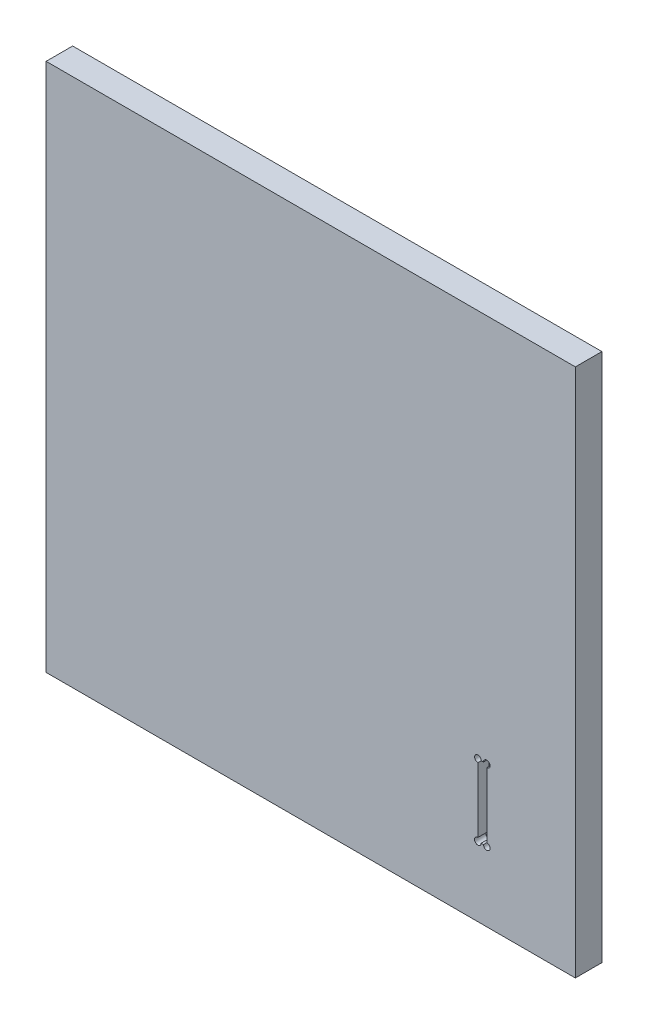
ISO-10303-21;
HEADER;
FILE_DESCRIPTION(('STEP AP214'),'2;1');
FILE_NAME('part.step','',(''),(''),'','','');
FILE_SCHEMA(('AUTOMOTIVE_DESIGN { 1 0 10303 214 1 1 1 1 }'));
ENDSEC;
DATA;
#1=APPLICATION_CONTEXT('core data for automotive mechanical design processes');
#2=APPLICATION_PROTOCOL_DEFINITION('international standard','automotive_design',2000,#1);
#3=PRODUCT_CONTEXT('',#1,'mechanical');
#4=PRODUCT('Part','Part','',(#3));
#5=PRODUCT_RELATED_PRODUCT_CATEGORY('part','',(#4));
#6=PRODUCT_DEFINITION_FORMATION('','',#4);
#7=PRODUCT_DEFINITION_CONTEXT('part definition',#1,'design');
#8=PRODUCT_DEFINITION('design','',#6,#7);
#9=PRODUCT_DEFINITION_SHAPE('','',#8);
#10=(LENGTH_UNIT() NAMED_UNIT(*) SI_UNIT(.MILLI.,.METRE.));
#11=(NAMED_UNIT(*) PLANE_ANGLE_UNIT() SI_UNIT($,.RADIAN.));
#12=(NAMED_UNIT(*) SI_UNIT($,.STERADIAN.) SOLID_ANGLE_UNIT());
#13=UNCERTAINTY_MEASURE_WITH_UNIT(LENGTH_MEASURE(1.E-05),#10,'distance_accuracy_value','');
#14=(GEOMETRIC_REPRESENTATION_CONTEXT(3) GLOBAL_UNCERTAINTY_ASSIGNED_CONTEXT((#13)) GLOBAL_UNIT_ASSIGNED_CONTEXT((#10,
#11,#12)) REPRESENTATION_CONTEXT('',''));
#15=CARTESIAN_POINT('',(0.,0.,0.));
#16=DIRECTION('',(0.,0.,1.));
#17=DIRECTION('',(1.,0.,0.));
#18=AXIS2_PLACEMENT_3D('',#15,#16,#17);
#19=CARTESIAN_POINT('',(190.,190.,19.05));
#20=DIRECTION('',(-1.,0.,0.));
#21=DIRECTION('',(0.,-1.,0.));
#22=AXIS2_PLACEMENT_3D('',#19,#20,#21);
#23=PLANE('',#22);
#24=DIRECTION('',(0.,1.,0.));
#25=VECTOR('',#24,1.);
#26=CARTESIAN_POINT('',(190.,190.,0.));
#27=LINE('',#26,#25);
#28=CARTESIAN_POINT('',(190.,-190.,0.));
#29=VERTEX_POINT('',#28);
#30=CARTESIAN_POINT('',(190.,190.,0.));
#31=VERTEX_POINT('',#30);
#32=EDGE_CURVE('E219',#29,#31,#27,.T.);
#33=ORIENTED_EDGE('',*,*,#32,.T.);
#34=DIRECTION('',(0.,0.,-1.));
#35=VECTOR('',#34,1.);
#36=CARTESIAN_POINT('',(190.,190.,19.05));
#37=LINE('',#36,#35);
#38=CARTESIAN_POINT('',(190.,190.,19.05));
#39=VERTEX_POINT('',#38);
#40=EDGE_CURVE('E12',#39,#31,#37,.T.);
#41=ORIENTED_EDGE('',*,*,#40,.F.);
#42=DIRECTION('',(0.,1.,0.));
#43=VECTOR('',#42,1.);
#44=CARTESIAN_POINT('',(190.,190.,19.05));
#45=LINE('',#44,#43);
#46=CARTESIAN_POINT('',(190.,-190.,19.05));
#47=VERTEX_POINT('',#46);
#48=EDGE_CURVE('E208',#47,#39,#45,.T.);
#49=ORIENTED_EDGE('',*,*,#48,.F.);
#50=DIRECTION('',(0.,0.,-1.));
#51=VECTOR('',#50,1.);
#52=CARTESIAN_POINT('',(190.,-190.,19.05));
#53=LINE('',#52,#51);
#54=EDGE_CURVE('E218',#47,#29,#53,.T.);
#55=ORIENTED_EDGE('',*,*,#54,.T.);
#56=EDGE_LOOP('',(#33,#41,#49,#55));
#57=FACE_BOUND('',#56,.T.);
#58=ADVANCED_FACE('F42',(#57),#23,.F.);
#59=CARTESIAN_POINT('',(-190.,190.,19.05));
#60=DIRECTION('',(0.,-1.,0.));
#61=DIRECTION('',(0.,0.,-1.));
#62=AXIS2_PLACEMENT_3D('',#59,#60,#61);
#63=PLANE('',#62);
#64=DIRECTION('',(-1.,0.,0.));
#65=VECTOR('',#64,1.);
#66=CARTESIAN_POINT('',(-190.,190.,0.));
#67=LINE('',#66,#65);
#68=CARTESIAN_POINT('',(-190.,190.,0.));
#69=VERTEX_POINT('',#68);
#70=EDGE_CURVE('E223',#31,#69,#67,.T.);
#71=ORIENTED_EDGE('',*,*,#70,.T.);
#72=DIRECTION('',(0.,0.,-1.));
#73=VECTOR('',#72,1.);
#74=CARTESIAN_POINT('',(-190.,190.,19.05));
#75=LINE('',#74,#73);
#76=CARTESIAN_POINT('',(-190.,190.,19.05));
#77=VERTEX_POINT('',#76);
#78=EDGE_CURVE('E50',#77,#69,#75,.T.);
#79=ORIENTED_EDGE('',*,*,#78,.F.);
#80=DIRECTION('',(-1.,0.,0.));
#81=VECTOR('',#80,1.);
#82=CARTESIAN_POINT('',(-190.,190.,19.05));
#83=LINE('',#82,#81);
#84=EDGE_CURVE('E94',#39,#77,#83,.T.);
#85=ORIENTED_EDGE('',*,*,#84,.F.);
#86=ORIENTED_EDGE('',*,*,#40,.T.);
#87=EDGE_LOOP('',(#71,#79,#85,#86));
#88=FACE_BOUND('',#87,.T.);
#89=ADVANCED_FACE('F259',(#88),#63,.F.);
#90=CARTESIAN_POINT('',(-190.,190.,19.05));
#91=DIRECTION('',(1.,0.,0.));
#92=DIRECTION('',(0.,1.,0.));
#93=AXIS2_PLACEMENT_3D('',#90,#91,#92);
#94=PLANE('',#93);
#95=DIRECTION('',(0.,-1.,0.));
#96=VECTOR('',#95,1.);
#97=CARTESIAN_POINT('',(-190.,190.,0.));
#98=LINE('',#97,#96);
#99=CARTESIAN_POINT('',(-190.,-190.,0.));
#100=VERTEX_POINT('',#99);
#101=EDGE_CURVE('E227',#69,#100,#98,.T.);
#102=ORIENTED_EDGE('',*,*,#101,.T.);
#103=DIRECTION('',(0.,0.,-1.));
#104=VECTOR('',#103,1.);
#105=CARTESIAN_POINT('',(-190.,-190.,19.05));
#106=LINE('',#105,#104);
#107=CARTESIAN_POINT('',(-190.,-190.,19.05));
#108=VERTEX_POINT('',#107);
#109=EDGE_CURVE('E234',#108,#100,#106,.T.);
#110=ORIENTED_EDGE('',*,*,#109,.F.);
#111=DIRECTION('',(0.,-1.,0.));
#112=VECTOR('',#111,1.);
#113=CARTESIAN_POINT('',(-190.,190.,19.05));
#114=LINE('',#113,#112);
#115=EDGE_CURVE('E213',#77,#108,#114,.T.);
#116=ORIENTED_EDGE('',*,*,#115,.F.);
#117=ORIENTED_EDGE('',*,*,#78,.T.);
#118=EDGE_LOOP('',(#102,#110,#116,#117));
#119=FACE_BOUND('',#118,.T.);
#120=ADVANCED_FACE('F241',(#119),#94,.F.);
#121=CARTESIAN_POINT('',(-190.,-190.,19.05));
#122=DIRECTION('',(0.,1.,0.));
#123=DIRECTION('',(0.,0.,1.));
#124=AXIS2_PLACEMENT_3D('',#121,#122,#123);
#125=PLANE('',#124);
#126=DIRECTION('',(1.,0.,0.));
#127=VECTOR('',#126,1.);
#128=CARTESIAN_POINT('',(-190.,-190.,0.));
#129=LINE('',#128,#127);
#130=EDGE_CURVE('E87',#100,#29,#129,.T.);
#131=ORIENTED_EDGE('',*,*,#130,.T.);
#132=ORIENTED_EDGE('',*,*,#54,.F.);
#133=DIRECTION('',(1.,0.,0.));
#134=VECTOR('',#133,1.);
#135=CARTESIAN_POINT('',(-190.,-190.,19.05));
#136=LINE('',#135,#134);
#137=EDGE_CURVE('E66',#108,#47,#136,.T.);
#138=ORIENTED_EDGE('',*,*,#137,.F.);
#139=ORIENTED_EDGE('',*,*,#109,.T.);
#140=EDGE_LOOP('',(#131,#132,#138,#139));
#141=FACE_BOUND('',#140,.T.);
#142=ADVANCED_FACE('F249',(#141),#125,.F.);
#143=CARTESIAN_POINT('',(0.,0.,19.05));
#144=DIRECTION('',(0.,0.,1.));
#145=DIRECTION('',(1.,0.,0.));
#146=AXIS2_PLACEMENT_3D('',#143,#144,#145);
#147=PLANE('',#146);
#148=CARTESIAN_POINT('',(120.,-140.,19.05));
#149=DIRECTION('',(0.,0.,1.));
#150=DIRECTION('',(1.,0.,0.));
#151=AXIS2_PLACEMENT_3D('',#148,#149,#150);
#152=CIRCLE('',#151,2.38125);
#153=CARTESIAN_POINT('',(120.,-137.61875,19.05));
#154=VERTEX_POINT('',#153);
#155=CARTESIAN_POINT('',(122.38125,-140.,19.05));
#156=VERTEX_POINT('',#155);
#157=EDGE_CURVE('E57',#154,#156,#152,.T.);
#158=ORIENTED_EDGE('',*,*,#157,.F.);
#159=DIRECTION('',(0.,-1.,0.));
#160=VECTOR('',#159,1.);
#161=CARTESIAN_POINT('',(120.,-137.61875,19.05));
#162=LINE('',#161,#160);
#163=CARTESIAN_POINT('',(120.,-91.0811187627877,19.05));
#164=VERTEX_POINT('',#163);
#165=EDGE_CURVE('E164',#164,#154,#162,.T.);
#166=ORIENTED_EDGE('',*,*,#165,.F.);
#167=CARTESIAN_POINT('',(120.025,-88.7,19.05));
#168=DIRECTION('',(0.,0.,1.));
#169=DIRECTION('',(1.,0.,0.));
#170=AXIS2_PLACEMENT_3D('',#167,#168,#169);
#171=CIRCLE('',#170,2.38125);
#172=CARTESIAN_POINT('',(122.40625,-88.7,19.05));
#173=VERTEX_POINT('',#172);
#174=EDGE_CURVE('E168',#173,#164,#171,.T.);
#175=ORIENTED_EDGE('',*,*,#174,.F.);
#176=DIRECTION('',(-1.,0.,0.));
#177=VECTOR('',#176,1.);
#178=CARTESIAN_POINT('',(122.40625,-88.7,19.05));
#179=LINE('',#178,#177);
#180=CARTESIAN_POINT('',(124.01875,-88.7,19.05));
#181=VERTEX_POINT('',#180);
#182=EDGE_CURVE('E393',#181,#173,#179,.T.);
#183=ORIENTED_EDGE('',*,*,#182,.F.);
#184=CARTESIAN_POINT('',(126.4,-88.7,19.05));
#185=DIRECTION('',(0.,0.,1.));
#186=DIRECTION('',(1.,0.,0.));
#187=AXIS2_PLACEMENT_3D('',#184,#185,#186);
#188=CIRCLE('',#187,2.38124999999999);
#189=CARTESIAN_POINT('',(126.4,-91.08125,19.05));
#190=VERTEX_POINT('',#189);
#191=EDGE_CURVE('E389',#190,#181,#188,.T.);
#192=ORIENTED_EDGE('',*,*,#191,.F.);
#193=DIRECTION('',(0.,1.,0.));
#194=VECTOR('',#193,1.);
#195=CARTESIAN_POINT('',(126.4,-137.61875,19.05));
#196=LINE('',#195,#194);
#197=CARTESIAN_POINT('',(126.4,-137.61875,19.05));
#198=VERTEX_POINT('',#197);
#199=EDGE_CURVE('E384',#198,#190,#196,.T.);
#200=ORIENTED_EDGE('',*,*,#199,.F.);
#201=CARTESIAN_POINT('',(126.4,-140.,19.05));
#202=DIRECTION('',(0.,0.,1.));
#203=DIRECTION('',(1.,0.,0.));
#204=AXIS2_PLACEMENT_3D('',#201,#202,#203);
#205=CIRCLE('',#204,2.38124999999999);
#206=CARTESIAN_POINT('',(124.01875,-140.,19.05));
#207=VERTEX_POINT('',#206);
#208=EDGE_CURVE('E379',#207,#198,#205,.T.);
#209=ORIENTED_EDGE('',*,*,#208,.F.);
#210=DIRECTION('',(1.,0.,0.));
#211=VECTOR('',#210,1.);
#212=CARTESIAN_POINT('',(122.38125,-140.,19.05));
#213=LINE('',#212,#211);
#214=EDGE_CURVE('E193',#156,#207,#213,.T.);
#215=ORIENTED_EDGE('',*,*,#214,.F.);
#216=EDGE_LOOP('',(#158,#166,#175,#183,#192,#200,#209,#215));
#217=FACE_BOUND('',#216,.T.);
#218=ORIENTED_EDGE('',*,*,#48,.T.);
#219=ORIENTED_EDGE('',*,*,#84,.T.);
#220=ORIENTED_EDGE('',*,*,#115,.T.);
#221=ORIENTED_EDGE('',*,*,#137,.T.);
#222=EDGE_LOOP('',(#218,#219,#220,#221));
#223=FACE_BOUND('',#222,.T.);
#224=ADVANCED_FACE('F251',(#217,#223),#147,.T.);
#225=CARTESIAN_POINT('',(0.,0.,0.));
#226=DIRECTION('',(0.,0.,1.));
#227=DIRECTION('',(1.,0.,0.));
#228=AXIS2_PLACEMENT_3D('',#225,#226,#227);
#229=PLANE('',#228);
#230=ORIENTED_EDGE('',*,*,#32,.F.);
#231=ORIENTED_EDGE('',*,*,#130,.F.);
#232=ORIENTED_EDGE('',*,*,#101,.F.);
#233=ORIENTED_EDGE('',*,*,#70,.F.);
#234=EDGE_LOOP('',(#230,#231,#232,#233));
#235=FACE_BOUND('',#234,.T.);
#236=ADVANCED_FACE('F245',(#235),#229,.F.);
#237=CARTESIAN_POINT('',(120.,-140.,11.05));
#238=DIRECTION('',(0.,0.,1.));
#239=DIRECTION('',(1.,0.,0.));
#240=AXIS2_PLACEMENT_3D('',#237,#238,#239);
#241=CYLINDRICAL_SURFACE('',#240,2.38125);
#242=ORIENTED_EDGE('',*,*,#157,.T.);
#243=DIRECTION('',(0.,0.,1.));
#244=VECTOR('',#243,1.);
#245=CARTESIAN_POINT('',(122.38125,-140.,11.05));
#246=LINE('',#245,#244);
#247=CARTESIAN_POINT('',(122.38125,-140.,11.05));
#248=VERTEX_POINT('',#247);
#249=EDGE_CURVE('E138',#248,#156,#246,.T.);
#250=ORIENTED_EDGE('',*,*,#249,.F.);
#251=CARTESIAN_POINT('',(120.,-140.,11.05));
#252=DIRECTION('',(0.,0.,1.));
#253=DIRECTION('',(1.,0.,0.));
#254=AXIS2_PLACEMENT_3D('',#251,#252,#253);
#255=CIRCLE('',#254,2.38125);
#256=CARTESIAN_POINT('',(120.,-137.61875,11.05));
#257=VERTEX_POINT('',#256);
#258=EDGE_CURVE('E142',#257,#248,#255,.T.);
#259=ORIENTED_EDGE('',*,*,#258,.F.);
#260=DIRECTION('',(0.,0.,1.));
#261=VECTOR('',#260,1.);
#262=CARTESIAN_POINT('',(120.,-137.61875,11.05));
#263=LINE('',#262,#261);
#264=EDGE_CURVE('E224',#257,#154,#263,.T.);
#265=ORIENTED_EDGE('',*,*,#264,.T.);
#266=EDGE_LOOP('',(#242,#250,#259,#265));
#267=FACE_BOUND('',#266,.T.);
#268=ADVANCED_FACE('F140',(#267),#241,.F.);
#269=CARTESIAN_POINT('',(120.,-137.61875,11.05));
#270=DIRECTION('',(-1.,0.,0.));
#271=DIRECTION('',(0.,0.,1.));
#272=AXIS2_PLACEMENT_3D('',#269,#270,#271);
#273=PLANE('',#272);
#274=ORIENTED_EDGE('',*,*,#165,.T.);
#275=ORIENTED_EDGE('',*,*,#264,.F.);
#276=DIRECTION('',(0.,-1.,0.));
#277=VECTOR('',#276,1.);
#278=CARTESIAN_POINT('',(120.,-137.61875,11.05));
#279=LINE('',#278,#277);
#280=CARTESIAN_POINT('',(120.,-91.0811187627877,11.05));
#281=VERTEX_POINT('',#280);
#282=EDGE_CURVE('E149',#281,#257,#279,.T.);
#283=ORIENTED_EDGE('',*,*,#282,.F.);
#284=DIRECTION('',(0.,0.,1.));
#285=VECTOR('',#284,1.);
#286=CARTESIAN_POINT('',(120.,-91.0811187627877,11.05));
#287=LINE('',#286,#285);
#288=EDGE_CURVE('E425',#281,#164,#287,.T.);
#289=ORIENTED_EDGE('',*,*,#288,.T.);
#290=EDGE_LOOP('',(#274,#275,#283,#289));
#291=FACE_BOUND('',#290,.T.);
#292=ADVANCED_FACE('F298',(#291),#273,.F.);
#293=CARTESIAN_POINT('',(120.025,-88.7,11.05));
#294=DIRECTION('',(0.,0.,1.));
#295=DIRECTION('',(1.,0.,0.));
#296=AXIS2_PLACEMENT_3D('',#293,#294,#295);
#297=CYLINDRICAL_SURFACE('',#296,2.38125);
#298=ORIENTED_EDGE('',*,*,#174,.T.);
#299=ORIENTED_EDGE('',*,*,#288,.F.);
#300=CARTESIAN_POINT('',(120.025,-88.7,11.05));
#301=DIRECTION('',(0.,0.,1.));
#302=DIRECTION('',(1.,0.,0.));
#303=AXIS2_PLACEMENT_3D('',#300,#301,#302);
#304=CIRCLE('',#303,2.38125);
#305=CARTESIAN_POINT('',(122.40625,-88.7,11.05));
#306=VERTEX_POINT('',#305);
#307=EDGE_CURVE('E185',#306,#281,#304,.T.);
#308=ORIENTED_EDGE('',*,*,#307,.F.);
#309=DIRECTION('',(0.,0.,1.));
#310=VECTOR('',#309,1.);
#311=CARTESIAN_POINT('',(122.40625,-88.7,11.05));
#312=LINE('',#311,#310);
#313=EDGE_CURVE('E420',#306,#173,#312,.T.);
#314=ORIENTED_EDGE('',*,*,#313,.T.);
#315=EDGE_LOOP('',(#298,#299,#308,#314));
#316=FACE_BOUND('',#315,.T.);
#317=ADVANCED_FACE('F307',(#316),#297,.F.);
#318=CARTESIAN_POINT('',(122.40625,-88.7,11.05));
#319=DIRECTION('',(0.,1.,0.));
#320=DIRECTION('',(0.,0.,1.));
#321=AXIS2_PLACEMENT_3D('',#318,#319,#320);
#322=PLANE('',#321);
#323=ORIENTED_EDGE('',*,*,#182,.T.);
#324=ORIENTED_EDGE('',*,*,#313,.F.);
#325=DIRECTION('',(-1.,0.,0.));
#326=VECTOR('',#325,1.);
#327=CARTESIAN_POINT('',(122.40625,-88.7,11.05));
#328=LINE('',#327,#326);
#329=CARTESIAN_POINT('',(124.01875,-88.7,11.05));
#330=VERTEX_POINT('',#329);
#331=EDGE_CURVE('E181',#330,#306,#328,.T.);
#332=ORIENTED_EDGE('',*,*,#331,.F.);
#333=DIRECTION('',(0.,0.,1.));
#334=VECTOR('',#333,1.);
#335=CARTESIAN_POINT('',(124.01875,-88.7,11.05));
#336=LINE('',#335,#334);
#337=EDGE_CURVE('E410',#330,#181,#336,.T.);
#338=ORIENTED_EDGE('',*,*,#337,.T.);
#339=EDGE_LOOP('',(#323,#324,#332,#338));
#340=FACE_BOUND('',#339,.T.);
#341=ADVANCED_FACE('F317',(#340),#322,.F.);
#342=CARTESIAN_POINT('',(126.4,-88.7,11.05));
#343=DIRECTION('',(0.,0.,1.));
#344=DIRECTION('',(1.,0.,0.));
#345=AXIS2_PLACEMENT_3D('',#342,#343,#344);
#346=CYLINDRICAL_SURFACE('',#345,2.38124999999999);
#347=ORIENTED_EDGE('',*,*,#191,.T.);
#348=ORIENTED_EDGE('',*,*,#337,.F.);
#349=CARTESIAN_POINT('',(126.4,-88.7,11.05));
#350=DIRECTION('',(0.,0.,1.));
#351=DIRECTION('',(1.,0.,0.));
#352=AXIS2_PLACEMENT_3D('',#349,#350,#351);
#353=CIRCLE('',#352,2.38124999999999);
#354=CARTESIAN_POINT('',(126.4,-91.08125,11.05));
#355=VERTEX_POINT('',#354);
#356=EDGE_CURVE('E177',#355,#330,#353,.T.);
#357=ORIENTED_EDGE('',*,*,#356,.F.);
#358=DIRECTION('',(0.,0.,1.));
#359=VECTOR('',#358,1.);
#360=CARTESIAN_POINT('',(126.4,-91.08125,11.05));
#361=LINE('',#360,#359);
#362=EDGE_CURVE('E406',#355,#190,#361,.T.);
#363=ORIENTED_EDGE('',*,*,#362,.T.);
#364=EDGE_LOOP('',(#347,#348,#357,#363));
#365=FACE_BOUND('',#364,.T.);
#366=ADVANCED_FACE('F327',(#365),#346,.F.);
#367=CARTESIAN_POINT('',(126.4,-137.61875,11.05));
#368=DIRECTION('',(1.,0.,0.));
#369=DIRECTION('',(0.,0.,-1.));
#370=AXIS2_PLACEMENT_3D('',#367,#368,#369);
#371=PLANE('',#370);
#372=ORIENTED_EDGE('',*,*,#199,.T.);
#373=ORIENTED_EDGE('',*,*,#362,.F.);
#374=DIRECTION('',(0.,1.,0.));
#375=VECTOR('',#374,1.);
#376=CARTESIAN_POINT('',(126.4,-137.61875,11.05));
#377=LINE('',#376,#375);
#378=CARTESIAN_POINT('',(126.4,-137.61875,11.05));
#379=VERTEX_POINT('',#378);
#380=EDGE_CURVE('E173',#379,#355,#377,.T.);
#381=ORIENTED_EDGE('',*,*,#380,.F.);
#382=DIRECTION('',(0.,0.,1.));
#383=VECTOR('',#382,1.);
#384=CARTESIAN_POINT('',(126.4,-137.61875,11.05));
#385=LINE('',#384,#383);
#386=EDGE_CURVE('E381',#379,#198,#385,.T.);
#387=ORIENTED_EDGE('',*,*,#386,.T.);
#388=EDGE_LOOP('',(#372,#373,#381,#387));
#389=FACE_BOUND('',#388,.T.);
#390=ADVANCED_FACE('F337',(#389),#371,.F.);
#391=CARTESIAN_POINT('',(126.4,-140.,11.05));
#392=DIRECTION('',(0.,0.,1.));
#393=DIRECTION('',(1.,0.,0.));
#394=AXIS2_PLACEMENT_3D('',#391,#392,#393);
#395=CYLINDRICAL_SURFACE('',#394,2.38124999999999);
#396=ORIENTED_EDGE('',*,*,#208,.T.);
#397=ORIENTED_EDGE('',*,*,#386,.F.);
#398=CARTESIAN_POINT('',(126.4,-140.,11.05));
#399=DIRECTION('',(0.,0.,1.));
#400=DIRECTION('',(1.,0.,0.));
#401=AXIS2_PLACEMENT_3D('',#398,#399,#400);
#402=CIRCLE('',#401,2.38124999999999);
#403=CARTESIAN_POINT('',(124.01875,-140.,11.05));
#404=VERTEX_POINT('',#403);
#405=EDGE_CURVE('E158',#404,#379,#402,.T.);
#406=ORIENTED_EDGE('',*,*,#405,.F.);
#407=DIRECTION('',(0.,0.,1.));
#408=VECTOR('',#407,1.);
#409=CARTESIAN_POINT('',(124.01875,-140.,11.05));
#410=LINE('',#409,#408);
#411=EDGE_CURVE('E148',#404,#207,#410,.T.);
#412=ORIENTED_EDGE('',*,*,#411,.T.);
#413=EDGE_LOOP('',(#396,#397,#406,#412));
#414=FACE_BOUND('',#413,.T.);
#415=ADVANCED_FACE('F347',(#414),#395,.F.);
#416=CARTESIAN_POINT('',(122.38125,-140.,11.05));
#417=DIRECTION('',(0.,-1.,0.));
#418=DIRECTION('',(0.,0.,-1.));
#419=AXIS2_PLACEMENT_3D('',#416,#417,#418);
#420=PLANE('',#419);
#421=ORIENTED_EDGE('',*,*,#214,.T.);
#422=ORIENTED_EDGE('',*,*,#411,.F.);
#423=DIRECTION('',(1.,0.,0.));
#424=VECTOR('',#423,1.);
#425=CARTESIAN_POINT('',(122.38125,-140.,11.05));
#426=LINE('',#425,#424);
#427=EDGE_CURVE('E152',#248,#404,#426,.T.);
#428=ORIENTED_EDGE('',*,*,#427,.F.);
#429=ORIENTED_EDGE('',*,*,#249,.T.);
#430=EDGE_LOOP('',(#421,#422,#428,#429));
#431=FACE_BOUND('',#430,.T.);
#432=ADVANCED_FACE('F153',(#431),#420,.F.);
#433=CARTESIAN_POINT('',(120.,-140.,11.05));
#434=DIRECTION('',(0.,0.,1.));
#435=DIRECTION('',(1.,0.,0.));
#436=AXIS2_PLACEMENT_3D('',#433,#434,#435);
#437=PLANE('',#436);
#438=ORIENTED_EDGE('',*,*,#258,.T.);
#439=ORIENTED_EDGE('',*,*,#427,.T.);
#440=ORIENTED_EDGE('',*,*,#405,.T.);
#441=ORIENTED_EDGE('',*,*,#380,.T.);
#442=ORIENTED_EDGE('',*,*,#356,.T.);
#443=ORIENTED_EDGE('',*,*,#331,.T.);
#444=ORIENTED_EDGE('',*,*,#307,.T.);
#445=ORIENTED_EDGE('',*,*,#282,.T.);
#446=EDGE_LOOP('',(#438,#439,#440,#441,#442,#443,#444,#445));
#447=FACE_BOUND('',#446,.T.);
#448=ADVANCED_FACE('F160',(#447),#437,.T.);
#449=CLOSED_SHELL('',(#58,#89,#120,#142,#224,#236,#268,#292,#317,#341,#366,#390,#415,#432,#448));
#450=MANIFOLD_SOLID_BREP('B2',#449);
#451=ADVANCED_BREP_SHAPE_REPRESENTATION('',(#18,#450),#14);
#452=SHAPE_DEFINITION_REPRESENTATION(#9,#451);
ENDSEC;
END-ISO-10303-21;
